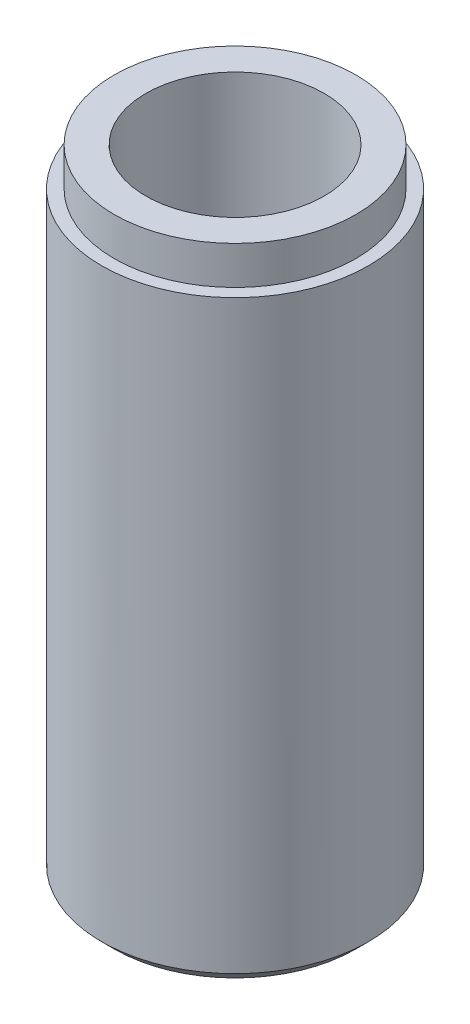
ISO-10303-21;
HEADER;
FILE_DESCRIPTION(('STEP AP214'),'2;1');
FILE_NAME('part.step','',(''),(''),'','','');
FILE_SCHEMA(('AUTOMOTIVE_DESIGN { 1 0 10303 214 1 1 1 1 }'));
ENDSEC;
DATA;
#1=APPLICATION_CONTEXT('core data for automotive mechanical design processes');
#2=APPLICATION_PROTOCOL_DEFINITION('international standard','automotive_design',2000,#1);
#3=PRODUCT_CONTEXT('',#1,'mechanical');
#4=PRODUCT('Part','Part','',(#3));
#5=PRODUCT_RELATED_PRODUCT_CATEGORY('part','',(#4));
#6=PRODUCT_DEFINITION_FORMATION('','',#4);
#7=PRODUCT_DEFINITION_CONTEXT('part definition',#1,'design');
#8=PRODUCT_DEFINITION('design','',#6,#7);
#9=PRODUCT_DEFINITION_SHAPE('','',#8);
#10=(LENGTH_UNIT() NAMED_UNIT(*) SI_UNIT(.MILLI.,.METRE.));
#11=(NAMED_UNIT(*) PLANE_ANGLE_UNIT() SI_UNIT($,.RADIAN.));
#12=(NAMED_UNIT(*) SI_UNIT($,.STERADIAN.) SOLID_ANGLE_UNIT());
#13=UNCERTAINTY_MEASURE_WITH_UNIT(LENGTH_MEASURE(1.E-05),#10,'distance_accuracy_value','');
#14=(GEOMETRIC_REPRESENTATION_CONTEXT(3) GLOBAL_UNCERTAINTY_ASSIGNED_CONTEXT((#13)) GLOBAL_UNIT_ASSIGNED_CONTEXT((#10,
#11,#12)) REPRESENTATION_CONTEXT('',''));
#15=CARTESIAN_POINT('',(0.,0.,0.));
#16=DIRECTION('',(0.,0.,1.));
#17=DIRECTION('',(1.,0.,0.));
#18=AXIS2_PLACEMENT_3D('',#15,#16,#17);
#19=CARTESIAN_POINT('',(7.,50.,0.));
#20=DIRECTION('',(0.,1.,0.));
#21=DIRECTION('',(0.,0.,1.));
#22=AXIS2_PLACEMENT_3D('',#19,#20,#21);
#23=PLANE('',#22);
#24=CARTESIAN_POINT('',(0.,50.,0.));
#25=DIRECTION('',(0.,-1.,0.));
#26=DIRECTION('',(0.,0.,-1.));
#27=AXIS2_PLACEMENT_3D('',#24,#25,#26);
#28=CIRCLE('',#27,7.);
#29=CARTESIAN_POINT('',(0.,50.,-7.));
#30=VERTEX_POINT('',#29);
#31=EDGE_CURVE('E48',#30,#30,#28,.T.);
#32=ORIENTED_EDGE('',*,*,#31,.T.);
#33=EDGE_LOOP('',(#32));
#34=FACE_BOUND('',#33,.T.);
#35=CARTESIAN_POINT('',(0.,50.,0.));
#36=DIRECTION('',(0.,1.,0.));
#37=DIRECTION('',(0.,0.,1.));
#38=AXIS2_PLACEMENT_3D('',#35,#36,#37);
#39=CIRCLE('',#38,9.5);
#40=CARTESIAN_POINT('',(0.,50.,9.5));
#41=VERTEX_POINT('',#40);
#42=EDGE_CURVE('E51',#41,#41,#39,.T.);
#43=ORIENTED_EDGE('',*,*,#42,.T.);
#44=EDGE_LOOP('',(#43));
#45=FACE_BOUND('',#44,.T.);
#46=ADVANCED_FACE('F31',(#34,#45),#23,.T.);
#47=CARTESIAN_POINT('',(0.,0.,0.));
#48=DIRECTION('',(0.,-1.,0.));
#49=DIRECTION('',(0.,0.,-1.));
#50=AXIS2_PLACEMENT_3D('',#47,#48,#49);
#51=CYLINDRICAL_SURFACE('',#50,10.4775);
#52=CARTESIAN_POINT('',(0.,0.999999999999989,0.));
#53=DIRECTION('',(0.,-1.,0.));
#54=DIRECTION('',(0.,0.,-1.));
#55=AXIS2_PLACEMENT_3D('',#52,#53,#54);
#56=CIRCLE('',#55,10.4775);
#57=CARTESIAN_POINT('',(0.,0.999999999999989,-10.4775));
#58=VERTEX_POINT('',#57);
#59=EDGE_CURVE('E11',#58,#58,#56,.F.);
#60=ORIENTED_EDGE('',*,*,#59,.T.);
#61=EDGE_LOOP('',(#60));
#62=FACE_BOUND('',#61,.T.);
#63=CARTESIAN_POINT('',(0.,47.,0.));
#64=DIRECTION('',(0.,1.,0.));
#65=DIRECTION('',(0.,0.,1.));
#66=AXIS2_PLACEMENT_3D('',#63,#64,#65);
#67=CIRCLE('',#66,10.4775);
#68=CARTESIAN_POINT('',(0.,47.,10.4775));
#69=VERTEX_POINT('',#68);
#70=EDGE_CURVE('E35',#69,#69,#67,.F.);
#71=ORIENTED_EDGE('',*,*,#70,.T.);
#72=EDGE_LOOP('',(#71));
#73=FACE_BOUND('',#72,.T.);
#74=ADVANCED_FACE('F61',(#62,#73),#51,.T.);
#75=CARTESIAN_POINT('',(10.4775,0.,0.));
#76=DIRECTION('',(0.,-1.,0.));
#77=DIRECTION('',(0.,0.,-1.));
#78=AXIS2_PLACEMENT_3D('',#75,#76,#77);
#79=PLANE('',#78);
#80=CARTESIAN_POINT('',(0.,0.,0.));
#81=DIRECTION('',(0.,-1.,0.));
#82=DIRECTION('',(0.,0.,-1.));
#83=AXIS2_PLACEMENT_3D('',#80,#81,#82);
#84=CIRCLE('',#83,9.47750000000001);
#85=CARTESIAN_POINT('',(0.,0.,-9.47750000000001));
#86=VERTEX_POINT('',#85);
#87=EDGE_CURVE('E39',#86,#86,#84,.T.);
#88=ORIENTED_EDGE('',*,*,#87,.T.);
#89=EDGE_LOOP('',(#88));
#90=FACE_BOUND('',#89,.T.);
#91=CARTESIAN_POINT('',(0.,0.,0.));
#92=DIRECTION('',(0.,-1.,0.));
#93=DIRECTION('',(0.,0.,-1.));
#94=AXIS2_PLACEMENT_3D('',#91,#92,#93);
#95=CIRCLE('',#94,7.);
#96=CARTESIAN_POINT('',(0.,0.,-7.));
#97=VERTEX_POINT('',#96);
#98=EDGE_CURVE('E43',#97,#97,#95,.T.);
#99=ORIENTED_EDGE('',*,*,#98,.F.);
#100=EDGE_LOOP('',(#99));
#101=FACE_BOUND('',#100,.T.);
#102=ADVANCED_FACE('F82',(#90,#101),#79,.T.);
#103=CARTESIAN_POINT('',(0.,0.,0.));
#104=DIRECTION('',(0.,-1.,0.));
#105=DIRECTION('',(0.,0.,-1.));
#106=AXIS2_PLACEMENT_3D('',#103,#104,#105);
#107=CYLINDRICAL_SURFACE('',#106,7.);
#108=ORIENTED_EDGE('',*,*,#98,.T.);
#109=EDGE_LOOP('',(#108));
#110=FACE_BOUND('',#109,.T.);
#111=ORIENTED_EDGE('',*,*,#31,.F.);
#112=EDGE_LOOP('',(#111));
#113=FACE_BOUND('',#112,.T.);
#114=ADVANCED_FACE('F73',(#110,#113),#107,.F.);
#115=CARTESIAN_POINT('',(0.,0.,0.));
#116=DIRECTION('',(0.,1.,0.));
#117=DIRECTION('',(0.,0.,1.));
#118=AXIS2_PLACEMENT_3D('',#115,#116,#117);
#119=CONICAL_SURFACE('',#118,9.47750000000001,0.785398163397448);
#120=ORIENTED_EDGE('',*,*,#59,.F.);
#121=EDGE_LOOP('',(#120));
#122=FACE_BOUND('',#121,.T.);
#123=ORIENTED_EDGE('',*,*,#87,.F.);
#124=EDGE_LOOP('',(#123));
#125=FACE_BOUND('',#124,.T.);
#126=ADVANCED_FACE('F33',(#122,#125),#119,.T.);
#127=CARTESIAN_POINT('',(0.,47.,0.));
#128=DIRECTION('',(0.,1.,0.));
#129=DIRECTION('',(0.,0.,1.));
#130=AXIS2_PLACEMENT_3D('',#127,#128,#129);
#131=PLANE('',#130);
#132=ORIENTED_EDGE('',*,*,#70,.F.);
#133=EDGE_LOOP('',(#132));
#134=FACE_BOUND('',#133,.T.);
#135=CARTESIAN_POINT('',(0.,47.,0.));
#136=DIRECTION('',(0.,1.,0.));
#137=DIRECTION('',(0.,0.,1.));
#138=AXIS2_PLACEMENT_3D('',#135,#136,#137);
#139=CIRCLE('',#138,9.5);
#140=CARTESIAN_POINT('',(0.,47.,9.5));
#141=VERTEX_POINT('',#140);
#142=EDGE_CURVE('E54',#141,#141,#139,.T.);
#143=ORIENTED_EDGE('',*,*,#142,.F.);
#144=EDGE_LOOP('',(#143));
#145=FACE_BOUND('',#144,.T.);
#146=ADVANCED_FACE('F63',(#134,#145),#131,.T.);
#147=CARTESIAN_POINT('',(0.,47.,0.));
#148=DIRECTION('',(0.,1.,0.));
#149=DIRECTION('',(0.,0.,1.));
#150=AXIS2_PLACEMENT_3D('',#147,#148,#149);
#151=CYLINDRICAL_SURFACE('',#150,9.5);
#152=ORIENTED_EDGE('',*,*,#142,.T.);
#153=EDGE_LOOP('',(#152));
#154=FACE_BOUND('',#153,.T.);
#155=ORIENTED_EDGE('',*,*,#42,.F.);
#156=EDGE_LOOP('',(#155));
#157=FACE_BOUND('',#156,.T.);
#158=ADVANCED_FACE('F66',(#154,#157),#151,.T.);
#159=CLOSED_SHELL('',(#46,#74,#102,#114,#126,#146,#158));
#160=MANIFOLD_SOLID_BREP('B2',#159);
#161=ADVANCED_BREP_SHAPE_REPRESENTATION('',(#18,#160),#14);
#162=SHAPE_DEFINITION_REPRESENTATION(#9,#161);
ENDSEC;
END-ISO-10303-21;
